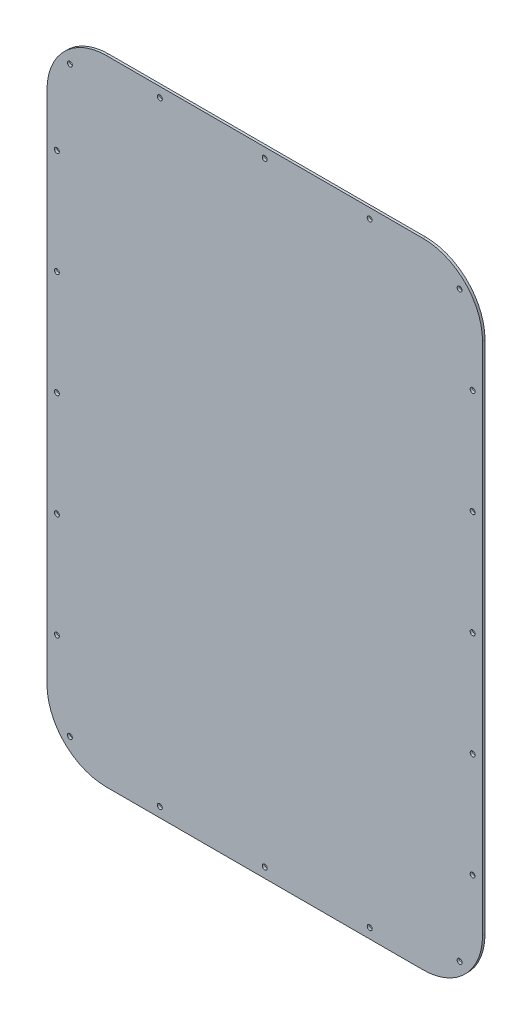
ISO-10303-21;
HEADER;
FILE_DESCRIPTION(('STEP AP214'),'2;1');
FILE_NAME('part.step','',(''),(''),'','','');
FILE_SCHEMA(('AUTOMOTIVE_DESIGN { 1 0 10303 214 1 1 1 1 }'));
ENDSEC;
DATA;
#1=APPLICATION_CONTEXT('core data for automotive mechanical design processes');
#2=APPLICATION_PROTOCOL_DEFINITION('international standard','automotive_design',2000,#1);
#3=PRODUCT_CONTEXT('',#1,'mechanical');
#4=PRODUCT('Part','Part','',(#3));
#5=PRODUCT_RELATED_PRODUCT_CATEGORY('part','',(#4));
#6=PRODUCT_DEFINITION_FORMATION('','',#4);
#7=PRODUCT_DEFINITION_CONTEXT('part definition',#1,'design');
#8=PRODUCT_DEFINITION('design','',#6,#7);
#9=PRODUCT_DEFINITION_SHAPE('','',#8);
#10=(LENGTH_UNIT() NAMED_UNIT(*) SI_UNIT(.MILLI.,.METRE.));
#11=(NAMED_UNIT(*) PLANE_ANGLE_UNIT() SI_UNIT($,.RADIAN.));
#12=(NAMED_UNIT(*) SI_UNIT($,.STERADIAN.) SOLID_ANGLE_UNIT());
#13=UNCERTAINTY_MEASURE_WITH_UNIT(LENGTH_MEASURE(1.E-05),#10,'distance_accuracy_value','');
#14=(GEOMETRIC_REPRESENTATION_CONTEXT(3) GLOBAL_UNCERTAINTY_ASSIGNED_CONTEXT((#13)) GLOBAL_UNIT_ASSIGNED_CONTEXT((#10,
#11,#12)) REPRESENTATION_CONTEXT('',''));
#15=CARTESIAN_POINT('',(0.,0.,0.));
#16=DIRECTION('',(0.,0.,1.));
#17=DIRECTION('',(1.,0.,0.));
#18=AXIS2_PLACEMENT_3D('',#15,#16,#17);
#19=CARTESIAN_POINT('',(152.4,1549.53972999994,3.175));
#20=DIRECTION('',(0.,0.,1.));
#21=DIRECTION('',(1.,0.,0.));
#22=AXIS2_PLACEMENT_3D('',#19,#20,#21);
#23=PLANE('',#22);
#24=CARTESIAN_POINT('',(220.98,1613.03972999994,3.175));
#25=DIRECTION('',(0.,0.,1.));
#26=DIRECTION('',(1.,0.,0.));
#27=AXIS2_PLACEMENT_3D('',#24,#25,#26);
#28=CIRCLE('',#27,3.17500000000012);
#29=CARTESIAN_POINT('',(224.155,1613.03972999994,3.175));
#30=VERTEX_POINT('',#29);
#31=EDGE_CURVE('E284',#30,#30,#28,.T.);
#32=ORIENTED_EDGE('',*,*,#31,.F.);
#33=EDGE_LOOP('',(#32));
#34=FACE_BOUND('',#33,.T.);
#35=CARTESIAN_POINT('',(355.6,825.63972999994,3.175));
#36=DIRECTION('',(0.,0.,1.));
#37=DIRECTION('',(1.,0.,0.));
#38=AXIS2_PLACEMENT_3D('',#35,#36,#37);
#39=CIRCLE('',#38,3.17499999999982);
#40=CARTESIAN_POINT('',(358.775,825.63972999994,3.175));
#41=VERTEX_POINT('',#40);
#42=EDGE_CURVE('E272',#41,#41,#39,.T.);
#43=ORIENTED_EDGE('',*,*,#42,.F.);
#44=EDGE_LOOP('',(#43));
#45=FACE_BOUND('',#44,.T.);
#46=CARTESIAN_POINT('',(220.98,825.63972999994,3.175));
#47=DIRECTION('',(0.,0.,1.));
#48=DIRECTION('',(1.,0.,0.));
#49=AXIS2_PLACEMENT_3D('',#46,#47,#48);
#50=CIRCLE('',#49,3.17499999999976);
#51=CARTESIAN_POINT('',(224.155,825.63972999994,3.175));
#52=VERTEX_POINT('',#51);
#53=EDGE_CURVE('E260',#52,#52,#50,.T.);
#54=ORIENTED_EDGE('',*,*,#53,.F.);
#55=EDGE_LOOP('',(#54));
#56=FACE_BOUND('',#55,.T.);
#57=CARTESIAN_POINT('',(622.3,1353.95972999994,3.175));
#58=DIRECTION('',(0.,0.,1.));
#59=DIRECTION('',(1.,0.,0.));
#60=AXIS2_PLACEMENT_3D('',#57,#58,#59);
#61=CIRCLE('',#60,3.17499999999971);
#62=CARTESIAN_POINT('',(625.475,1353.95972999994,3.175));
#63=VERTEX_POINT('',#62);
#64=EDGE_CURVE('E248',#63,#63,#61,.T.);
#65=ORIENTED_EDGE('',*,*,#64,.F.);
#66=EDGE_LOOP('',(#65));
#67=FACE_BOUND('',#66,.T.);
#68=CARTESIAN_POINT('',(622.3,1084.71972999994,3.175));
#69=DIRECTION('',(0.,0.,1.));
#70=DIRECTION('',(1.,0.,0.));
#71=AXIS2_PLACEMENT_3D('',#68,#69,#70);
#72=CIRCLE('',#71,3.17499999999971);
#73=CARTESIAN_POINT('',(625.475,1084.71972999994,3.175));
#74=VERTEX_POINT('',#73);
#75=EDGE_CURVE('E236',#74,#74,#72,.T.);
#76=ORIENTED_EDGE('',*,*,#75,.F.);
#77=EDGE_LOOP('',(#76));
#78=FACE_BOUND('',#77,.T.);
#79=CARTESIAN_POINT('',(622.3,1219.33972999994,3.175));
#80=DIRECTION('',(0.,0.,1.));
#81=DIRECTION('',(1.,0.,0.));
#82=AXIS2_PLACEMENT_3D('',#79,#80,#81);
#83=CIRCLE('',#82,3.17499999999971);
#84=CARTESIAN_POINT('',(625.475,1219.33972999994,3.175));
#85=VERTEX_POINT('',#84);
#86=EDGE_CURVE('E224',#85,#85,#83,.T.);
#87=ORIENTED_EDGE('',*,*,#86,.F.);
#88=EDGE_LOOP('',(#87));
#89=FACE_BOUND('',#88,.T.);
#90=CARTESIAN_POINT('',(88.9,1353.95972999994,3.175));
#91=DIRECTION('',(0.,0.,1.));
#92=DIRECTION('',(1.,0.,0.));
#93=AXIS2_PLACEMENT_3D('',#90,#91,#92);
#94=CIRCLE('',#93,3.17500000000003);
#95=CARTESIAN_POINT('',(92.075,1353.95972999994,3.175));
#96=VERTEX_POINT('',#95);
#97=EDGE_CURVE('E212',#96,#96,#94,.T.);
#98=ORIENTED_EDGE('',*,*,#97,.F.);
#99=EDGE_LOOP('',(#98));
#100=FACE_BOUND('',#99,.T.);
#101=CARTESIAN_POINT('',(88.9,1084.71972999994,3.175));
#102=DIRECTION('',(0.,0.,1.));
#103=DIRECTION('',(1.,0.,0.));
#104=AXIS2_PLACEMENT_3D('',#101,#102,#103);
#105=CIRCLE('',#104,3.1749999999998);
#106=CARTESIAN_POINT('',(92.0749999999998,1084.71972999994,3.175));
#107=VERTEX_POINT('',#106);
#108=EDGE_CURVE('E200',#107,#107,#105,.T.);
#109=ORIENTED_EDGE('',*,*,#108,.F.);
#110=EDGE_LOOP('',(#109));
#111=FACE_BOUND('',#110,.T.);
#112=CARTESIAN_POINT('',(105.58268435364,845.81218685586,3.175));
#113=DIRECTION('',(0.,0.,1.));
#114=DIRECTION('',(1.,0.,0.));
#115=AXIS2_PLACEMENT_3D('',#112,#113,#114);
#116=CIRCLE('',#115,3.17499999999978);
#117=CARTESIAN_POINT('',(108.75768435364,845.81218685586,3.175));
#118=VERTEX_POINT('',#117);
#119=EDGE_CURVE('E188',#118,#118,#116,.T.);
#120=ORIENTED_EDGE('',*,*,#119,.F.);
#121=EDGE_LOOP('',(#120));
#122=FACE_BOUND('',#121,.T.);
#123=CARTESIAN_POINT('',(605.61731564636,1592.86727314402,3.175));
#124=DIRECTION('',(0.,0.,1.));
#125=DIRECTION('',(1.,0.,0.));
#126=AXIS2_PLACEMENT_3D('',#123,#124,#125);
#127=CIRCLE('',#126,3.17500000000026);
#128=CARTESIAN_POINT('',(608.79231564636,1592.86727314402,3.175));
#129=VERTEX_POINT('',#128);
#130=EDGE_CURVE('E134',#129,#129,#127,.T.);
#131=ORIENTED_EDGE('',*,*,#130,.F.);
#132=EDGE_LOOP('',(#131));
#133=FACE_BOUND('',#132,.T.);
#134=CARTESIAN_POINT('',(152.4,1549.53972999994,3.175));
#135=DIRECTION('',(0.,0.,1.));
#136=DIRECTION('',(1.,0.,0.));
#137=AXIS2_PLACEMENT_3D('',#134,#135,#136);
#138=CIRCLE('',#137,76.2000000000004);
#139=CARTESIAN_POINT('',(152.4,1625.73972999994,3.175));
#140=VERTEX_POINT('',#139);
#141=CARTESIAN_POINT('',(76.2,1549.53972999994,3.175));
#142=VERTEX_POINT('',#141);
#143=EDGE_CURVE('E145',#140,#142,#138,.T.);
#144=ORIENTED_EDGE('',*,*,#143,.T.);
#145=DIRECTION('',(0.,-1.,0.));
#146=VECTOR('',#145,1.);
#147=CARTESIAN_POINT('',(76.2,1549.53972999994,3.175));
#148=LINE('',#147,#146);
#149=CARTESIAN_POINT('',(76.2,889.13972999994,3.175));
#150=VERTEX_POINT('',#149);
#151=EDGE_CURVE('E93',#142,#150,#148,.T.);
#152=ORIENTED_EDGE('',*,*,#151,.T.);
#153=CARTESIAN_POINT('',(152.4,889.13972999994,3.175));
#154=DIRECTION('',(0.,0.,1.));
#155=DIRECTION('',(1.,0.,0.));
#156=AXIS2_PLACEMENT_3D('',#153,#154,#155);
#157=CIRCLE('',#156,76.2000000000002);
#158=CARTESIAN_POINT('',(152.4,812.93972999994,3.175));
#159=VERTEX_POINT('',#158);
#160=EDGE_CURVE('E160',#150,#159,#157,.T.);
#161=ORIENTED_EDGE('',*,*,#160,.T.);
#162=DIRECTION('',(1.,0.,0.));
#163=VECTOR('',#162,1.);
#164=CARTESIAN_POINT('',(152.4,812.93972999994,3.175));
#165=LINE('',#164,#163);
#166=CARTESIAN_POINT('',(558.8,812.93972999994,3.175));
#167=VERTEX_POINT('',#166);
#168=EDGE_CURVE('E173',#159,#167,#165,.T.);
#169=ORIENTED_EDGE('',*,*,#168,.T.);
#170=CARTESIAN_POINT('',(558.8,889.13972999994,3.175));
#171=DIRECTION('',(0.,0.,1.));
#172=DIRECTION('',(1.,0.,0.));
#173=AXIS2_PLACEMENT_3D('',#170,#171,#172);
#174=CIRCLE('',#173,76.2000000000002);
#175=CARTESIAN_POINT('',(635.,889.13972999994,3.175));
#176=VERTEX_POINT('',#175);
#177=EDGE_CURVE('E112',#167,#176,#174,.T.);
#178=ORIENTED_EDGE('',*,*,#177,.T.);
#179=DIRECTION('',(0.,1.,0.));
#180=VECTOR('',#179,1.);
#181=CARTESIAN_POINT('',(635.,889.13972999994,3.175));
#182=LINE('',#181,#180);
#183=CARTESIAN_POINT('',(635.,1549.53972999994,3.175));
#184=VERTEX_POINT('',#183);
#185=EDGE_CURVE('E106',#176,#184,#182,.T.);
#186=ORIENTED_EDGE('',*,*,#185,.T.);
#187=CARTESIAN_POINT('',(558.8,1549.53972999994,3.175));
#188=DIRECTION('',(0.,0.,1.));
#189=DIRECTION('',(1.,0.,0.));
#190=AXIS2_PLACEMENT_3D('',#187,#188,#189);
#191=CIRCLE('',#190,76.1999999999996);
#192=CARTESIAN_POINT('',(558.8,1625.73972999994,3.175));
#193=VERTEX_POINT('',#192);
#194=EDGE_CURVE('E110',#184,#193,#191,.T.);
#195=ORIENTED_EDGE('',*,*,#194,.T.);
#196=DIRECTION('',(-1.,0.,0.));
#197=VECTOR('',#196,1.);
#198=CARTESIAN_POINT('',(558.8,1625.73972999994,3.175));
#199=LINE('',#198,#197);
#200=EDGE_CURVE('E50',#193,#140,#199,.T.);
#201=ORIENTED_EDGE('',*,*,#200,.T.);
#202=EDGE_LOOP('',(#144,#152,#161,#169,#178,#186,#195,#201));
#203=FACE_BOUND('',#202,.T.);
#204=CARTESIAN_POINT('',(605.61731564636,845.81218685586,3.175));
#205=DIRECTION('',(0.,0.,1.));
#206=DIRECTION('',(1.,0.,0.));
#207=AXIS2_PLACEMENT_3D('',#204,#205,#206);
#208=CIRCLE('',#207,3.17500000000004);
#209=CARTESIAN_POINT('',(608.79231564636,845.81218685586,3.175));
#210=VERTEX_POINT('',#209);
#211=EDGE_CURVE('E182',#210,#210,#208,.T.);
#212=ORIENTED_EDGE('',*,*,#211,.F.);
#213=EDGE_LOOP('',(#212));
#214=FACE_BOUND('',#213,.T.);
#215=CARTESIAN_POINT('',(88.9,1219.33972999994,3.175));
#216=DIRECTION('',(0.,0.,1.));
#217=DIRECTION('',(1.,0.,0.));
#218=AXIS2_PLACEMENT_3D('',#215,#216,#217);
#219=CIRCLE('',#218,3.1749999999998);
#220=CARTESIAN_POINT('',(92.0749999999998,1219.33972999994,3.175));
#221=VERTEX_POINT('',#220);
#222=EDGE_CURVE('E194',#221,#221,#219,.T.);
#223=ORIENTED_EDGE('',*,*,#222,.F.);
#224=EDGE_LOOP('',(#223));
#225=FACE_BOUND('',#224,.T.);
#226=CARTESIAN_POINT('',(88.9,1488.57972999994,3.175));
#227=DIRECTION('',(0.,0.,1.));
#228=DIRECTION('',(1.,0.,0.));
#229=AXIS2_PLACEMENT_3D('',#226,#227,#228);
#230=CIRCLE('',#229,3.17500000000019);
#231=CARTESIAN_POINT('',(92.0750000000002,1488.57972999994,3.175));
#232=VERTEX_POINT('',#231);
#233=EDGE_CURVE('E206',#232,#232,#230,.T.);
#234=ORIENTED_EDGE('',*,*,#233,.F.);
#235=EDGE_LOOP('',(#234));
#236=FACE_BOUND('',#235,.T.);
#237=CARTESIAN_POINT('',(88.9,950.09972999994,3.175));
#238=DIRECTION('',(0.,0.,1.));
#239=DIRECTION('',(1.,0.,0.));
#240=AXIS2_PLACEMENT_3D('',#237,#238,#239);
#241=CIRCLE('',#240,3.17499999999989);
#242=CARTESIAN_POINT('',(92.0749999999999,950.09972999994,3.175));
#243=VERTEX_POINT('',#242);
#244=EDGE_CURVE('E218',#243,#243,#241,.T.);
#245=ORIENTED_EDGE('',*,*,#244,.F.);
#246=EDGE_LOOP('',(#245));
#247=FACE_BOUND('',#246,.T.);
#248=CARTESIAN_POINT('',(622.3,950.09972999994,3.175));
#249=DIRECTION('',(0.,0.,1.));
#250=DIRECTION('',(1.,0.,0.));
#251=AXIS2_PLACEMENT_3D('',#248,#249,#250);
#252=CIRCLE('',#251,3.17499999999971);
#253=CARTESIAN_POINT('',(625.475,950.09972999994,3.175));
#254=VERTEX_POINT('',#253);
#255=EDGE_CURVE('E230',#254,#254,#252,.T.);
#256=ORIENTED_EDGE('',*,*,#255,.F.);
#257=EDGE_LOOP('',(#256));
#258=FACE_BOUND('',#257,.T.);
#259=CARTESIAN_POINT('',(622.3,1488.57972999994,3.175));
#260=DIRECTION('',(0.,0.,1.));
#261=DIRECTION('',(1.,0.,0.));
#262=AXIS2_PLACEMENT_3D('',#259,#260,#261);
#263=CIRCLE('',#262,3.17499999999993);
#264=CARTESIAN_POINT('',(625.475,1488.57972999994,3.175));
#265=VERTEX_POINT('',#264);
#266=EDGE_CURVE('E242',#265,#265,#263,.T.);
#267=ORIENTED_EDGE('',*,*,#266,.F.);
#268=EDGE_LOOP('',(#267));
#269=FACE_BOUND('',#268,.T.);
#270=CARTESIAN_POINT('',(355.6,1613.03972999994,3.175));
#271=DIRECTION('',(0.,0.,1.));
#272=DIRECTION('',(1.,0.,0.));
#273=AXIS2_PLACEMENT_3D('',#270,#271,#272);
#274=CIRCLE('',#273,3.17500000000015);
#275=CARTESIAN_POINT('',(358.775,1613.03972999994,3.175));
#276=VERTEX_POINT('',#275);
#277=EDGE_CURVE('E254',#276,#276,#274,.T.);
#278=ORIENTED_EDGE('',*,*,#277,.F.);
#279=EDGE_LOOP('',(#278));
#280=FACE_BOUND('',#279,.T.);
#281=CARTESIAN_POINT('',(490.22,825.63972999994,3.175));
#282=DIRECTION('',(0.,0.,1.));
#283=DIRECTION('',(1.,0.,0.));
#284=AXIS2_PLACEMENT_3D('',#281,#282,#283);
#285=CIRCLE('',#284,3.17499999999982);
#286=CARTESIAN_POINT('',(493.395,825.63972999994,3.175));
#287=VERTEX_POINT('',#286);
#288=EDGE_CURVE('E266',#287,#287,#285,.T.);
#289=ORIENTED_EDGE('',*,*,#288,.F.);
#290=EDGE_LOOP('',(#289));
#291=FACE_BOUND('',#290,.T.);
#292=CARTESIAN_POINT('',(105.58268435364,1592.86727314402,3.175));
#293=DIRECTION('',(0.,0.,1.));
#294=DIRECTION('',(1.,0.,0.));
#295=AXIS2_PLACEMENT_3D('',#292,#293,#294);
#296=CIRCLE('',#295,3.17499999999982);
#297=CARTESIAN_POINT('',(108.75768435364,1592.86727314402,3.175));
#298=VERTEX_POINT('',#297);
#299=EDGE_CURVE('E278',#298,#298,#296,.T.);
#300=ORIENTED_EDGE('',*,*,#299,.F.);
#301=EDGE_LOOP('',(#300));
#302=FACE_BOUND('',#301,.T.);
#303=CARTESIAN_POINT('',(490.22,1613.03972999994,3.175));
#304=DIRECTION('',(0.,0.,1.));
#305=DIRECTION('',(1.,0.,0.));
#306=AXIS2_PLACEMENT_3D('',#303,#304,#305);
#307=CIRCLE('',#306,3.17499999999971);
#308=CARTESIAN_POINT('',(493.395,1613.03972999994,3.175));
#309=VERTEX_POINT('',#308);
#310=EDGE_CURVE('E290',#309,#309,#307,.T.);
#311=ORIENTED_EDGE('',*,*,#310,.F.);
#312=EDGE_LOOP('',(#311));
#313=FACE_BOUND('',#312,.T.);
#314=ADVANCED_FACE('F33',(#34,#45,#56,#67,#78,#89,#100,#111,#122,#133,#203,#214,#225,#236,#247,
#258,#269,#280,#291,#302,#313),#23,.T.);
#315=CARTESIAN_POINT('',(152.4,1549.53972999994,0.));
#316=DIRECTION('',(0.,0.,1.));
#317=DIRECTION('',(1.,0.,0.));
#318=AXIS2_PLACEMENT_3D('',#315,#316,#317);
#319=PLANE('',#318);
#320=CARTESIAN_POINT('',(152.4,1549.53972999994,0.));
#321=DIRECTION('',(0.,0.,1.));
#322=DIRECTION('',(1.,0.,0.));
#323=AXIS2_PLACEMENT_3D('',#320,#321,#322);
#324=CIRCLE('',#323,76.2000000000004);
#325=CARTESIAN_POINT('',(152.4,1625.73972999994,0.));
#326=VERTEX_POINT('',#325);
#327=CARTESIAN_POINT('',(76.2,1549.53972999994,0.));
#328=VERTEX_POINT('',#327);
#329=EDGE_CURVE('E130',#326,#328,#324,.T.);
#330=ORIENTED_EDGE('',*,*,#329,.F.);
#331=DIRECTION('',(-1.,0.,0.));
#332=VECTOR('',#331,1.);
#333=CARTESIAN_POINT('',(558.8,1625.73972999994,0.));
#334=LINE('',#333,#332);
#335=CARTESIAN_POINT('',(558.8,1625.73972999994,0.));
#336=VERTEX_POINT('',#335);
#337=EDGE_CURVE('E85',#336,#326,#334,.T.);
#338=ORIENTED_EDGE('',*,*,#337,.F.);
#339=CARTESIAN_POINT('',(558.8,1549.53972999994,0.));
#340=DIRECTION('',(0.,0.,1.));
#341=DIRECTION('',(1.,0.,0.));
#342=AXIS2_PLACEMENT_3D('',#339,#340,#341);
#343=CIRCLE('',#342,76.1999999999996);
#344=CARTESIAN_POINT('',(635.,1549.53972999994,0.));
#345=VERTEX_POINT('',#344);
#346=EDGE_CURVE('E79',#345,#336,#343,.T.);
#347=ORIENTED_EDGE('',*,*,#346,.F.);
#348=DIRECTION('',(0.,1.,0.));
#349=VECTOR('',#348,1.);
#350=CARTESIAN_POINT('',(635.,889.13972999994,0.));
#351=LINE('',#350,#349);
#352=CARTESIAN_POINT('',(635.,889.13972999994,0.));
#353=VERTEX_POINT('',#352);
#354=EDGE_CURVE('E120',#353,#345,#351,.T.);
#355=ORIENTED_EDGE('',*,*,#354,.F.);
#356=CARTESIAN_POINT('',(558.8,889.13972999994,0.));
#357=DIRECTION('',(0.,0.,1.));
#358=DIRECTION('',(1.,0.,0.));
#359=AXIS2_PLACEMENT_3D('',#356,#357,#358);
#360=CIRCLE('',#359,76.2000000000002);
#361=CARTESIAN_POINT('',(558.8,812.93972999994,0.));
#362=VERTEX_POINT('',#361);
#363=EDGE_CURVE('E140',#362,#353,#360,.T.);
#364=ORIENTED_EDGE('',*,*,#363,.F.);
#365=DIRECTION('',(1.,0.,0.));
#366=VECTOR('',#365,1.);
#367=CARTESIAN_POINT('',(152.4,812.93972999994,0.));
#368=LINE('',#367,#366);
#369=CARTESIAN_POINT('',(152.4,812.93972999994,0.));
#370=VERTEX_POINT('',#369);
#371=EDGE_CURVE('E138',#370,#362,#368,.T.);
#372=ORIENTED_EDGE('',*,*,#371,.F.);
#373=CARTESIAN_POINT('',(152.4,889.13972999994,0.));
#374=DIRECTION('',(0.,0.,1.));
#375=DIRECTION('',(1.,0.,0.));
#376=AXIS2_PLACEMENT_3D('',#373,#374,#375);
#377=CIRCLE('',#376,76.2000000000002);
#378=CARTESIAN_POINT('',(76.2,889.13972999994,0.));
#379=VERTEX_POINT('',#378);
#380=EDGE_CURVE('E136',#379,#370,#377,.T.);
#381=ORIENTED_EDGE('',*,*,#380,.F.);
#382=DIRECTION('',(0.,-1.,0.));
#383=VECTOR('',#382,1.);
#384=CARTESIAN_POINT('',(76.2,1549.53972999994,0.));
#385=LINE('',#384,#383);
#386=EDGE_CURVE('E133',#328,#379,#385,.T.);
#387=ORIENTED_EDGE('',*,*,#386,.F.);
#388=EDGE_LOOP('',(#330,#338,#347,#355,#364,#372,#381,#387));
#389=FACE_BOUND('',#388,.T.);
#390=CARTESIAN_POINT('',(605.61731564636,1592.86727314402,0.));
#391=DIRECTION('',(0.,0.,1.));
#392=DIRECTION('',(1.,0.,0.));
#393=AXIS2_PLACEMENT_3D('',#390,#391,#392);
#394=CIRCLE('',#393,3.17500000000026);
#395=CARTESIAN_POINT('',(608.79231564636,1592.86727314402,0.));
#396=VERTEX_POINT('',#395);
#397=EDGE_CURVE('E179',#396,#396,#394,.T.);
#398=ORIENTED_EDGE('',*,*,#397,.T.);
#399=EDGE_LOOP('',(#398));
#400=FACE_BOUND('',#399,.T.);
#401=CARTESIAN_POINT('',(605.61731564636,845.81218685586,0.));
#402=DIRECTION('',(0.,0.,1.));
#403=DIRECTION('',(1.,0.,0.));
#404=AXIS2_PLACEMENT_3D('',#401,#402,#403);
#405=CIRCLE('',#404,3.17500000000004);
#406=CARTESIAN_POINT('',(608.79231564636,845.81218685586,0.));
#407=VERTEX_POINT('',#406);
#408=EDGE_CURVE('E185',#407,#407,#405,.T.);
#409=ORIENTED_EDGE('',*,*,#408,.T.);
#410=EDGE_LOOP('',(#409));
#411=FACE_BOUND('',#410,.T.);
#412=CARTESIAN_POINT('',(105.58268435364,845.81218685586,0.));
#413=DIRECTION('',(0.,0.,1.));
#414=DIRECTION('',(1.,0.,0.));
#415=AXIS2_PLACEMENT_3D('',#412,#413,#414);
#416=CIRCLE('',#415,3.17499999999978);
#417=CARTESIAN_POINT('',(108.75768435364,845.81218685586,0.));
#418=VERTEX_POINT('',#417);
#419=EDGE_CURVE('E191',#418,#418,#416,.T.);
#420=ORIENTED_EDGE('',*,*,#419,.T.);
#421=EDGE_LOOP('',(#420));
#422=FACE_BOUND('',#421,.T.);
#423=CARTESIAN_POINT('',(88.9,1219.33972999994,0.));
#424=DIRECTION('',(0.,0.,1.));
#425=DIRECTION('',(1.,0.,0.));
#426=AXIS2_PLACEMENT_3D('',#423,#424,#425);
#427=CIRCLE('',#426,3.1749999999998);
#428=CARTESIAN_POINT('',(92.0749999999998,1219.33972999994,0.));
#429=VERTEX_POINT('',#428);
#430=EDGE_CURVE('E197',#429,#429,#427,.T.);
#431=ORIENTED_EDGE('',*,*,#430,.T.);
#432=EDGE_LOOP('',(#431));
#433=FACE_BOUND('',#432,.T.);
#434=CARTESIAN_POINT('',(88.9,1084.71972999994,0.));
#435=DIRECTION('',(0.,0.,1.));
#436=DIRECTION('',(1.,0.,0.));
#437=AXIS2_PLACEMENT_3D('',#434,#435,#436);
#438=CIRCLE('',#437,3.1749999999998);
#439=CARTESIAN_POINT('',(92.0749999999998,1084.71972999994,0.));
#440=VERTEX_POINT('',#439);
#441=EDGE_CURVE('E203',#440,#440,#438,.T.);
#442=ORIENTED_EDGE('',*,*,#441,.T.);
#443=EDGE_LOOP('',(#442));
#444=FACE_BOUND('',#443,.T.);
#445=CARTESIAN_POINT('',(88.9,1488.57972999994,0.));
#446=DIRECTION('',(0.,0.,1.));
#447=DIRECTION('',(1.,0.,0.));
#448=AXIS2_PLACEMENT_3D('',#445,#446,#447);
#449=CIRCLE('',#448,3.17500000000019);
#450=CARTESIAN_POINT('',(92.0750000000002,1488.57972999994,0.));
#451=VERTEX_POINT('',#450);
#452=EDGE_CURVE('E209',#451,#451,#449,.T.);
#453=ORIENTED_EDGE('',*,*,#452,.T.);
#454=EDGE_LOOP('',(#453));
#455=FACE_BOUND('',#454,.T.);
#456=CARTESIAN_POINT('',(88.9,1353.95972999994,0.));
#457=DIRECTION('',(0.,0.,1.));
#458=DIRECTION('',(1.,0.,0.));
#459=AXIS2_PLACEMENT_3D('',#456,#457,#458);
#460=CIRCLE('',#459,3.17500000000003);
#461=CARTESIAN_POINT('',(92.075,1353.95972999994,0.));
#462=VERTEX_POINT('',#461);
#463=EDGE_CURVE('E215',#462,#462,#460,.T.);
#464=ORIENTED_EDGE('',*,*,#463,.T.);
#465=EDGE_LOOP('',(#464));
#466=FACE_BOUND('',#465,.T.);
#467=CARTESIAN_POINT('',(88.9,950.09972999994,0.));
#468=DIRECTION('',(0.,0.,1.));
#469=DIRECTION('',(1.,0.,0.));
#470=AXIS2_PLACEMENT_3D('',#467,#468,#469);
#471=CIRCLE('',#470,3.17499999999989);
#472=CARTESIAN_POINT('',(92.0749999999999,950.09972999994,0.));
#473=VERTEX_POINT('',#472);
#474=EDGE_CURVE('E221',#473,#473,#471,.T.);
#475=ORIENTED_EDGE('',*,*,#474,.T.);
#476=EDGE_LOOP('',(#475));
#477=FACE_BOUND('',#476,.T.);
#478=CARTESIAN_POINT('',(622.3,1219.33972999994,0.));
#479=DIRECTION('',(0.,0.,1.));
#480=DIRECTION('',(1.,0.,0.));
#481=AXIS2_PLACEMENT_3D('',#478,#479,#480);
#482=CIRCLE('',#481,3.17499999999971);
#483=CARTESIAN_POINT('',(625.475,1219.33972999994,0.));
#484=VERTEX_POINT('',#483);
#485=EDGE_CURVE('E227',#484,#484,#482,.T.);
#486=ORIENTED_EDGE('',*,*,#485,.T.);
#487=EDGE_LOOP('',(#486));
#488=FACE_BOUND('',#487,.T.);
#489=CARTESIAN_POINT('',(622.3,950.09972999994,0.));
#490=DIRECTION('',(0.,0.,1.));
#491=DIRECTION('',(1.,0.,0.));
#492=AXIS2_PLACEMENT_3D('',#489,#490,#491);
#493=CIRCLE('',#492,3.17499999999971);
#494=CARTESIAN_POINT('',(625.475,950.09972999994,0.));
#495=VERTEX_POINT('',#494);
#496=EDGE_CURVE('E233',#495,#495,#493,.T.);
#497=ORIENTED_EDGE('',*,*,#496,.T.);
#498=EDGE_LOOP('',(#497));
#499=FACE_BOUND('',#498,.T.);
#500=CARTESIAN_POINT('',(622.3,1084.71972999994,0.));
#501=DIRECTION('',(0.,0.,1.));
#502=DIRECTION('',(1.,0.,0.));
#503=AXIS2_PLACEMENT_3D('',#500,#501,#502);
#504=CIRCLE('',#503,3.17499999999971);
#505=CARTESIAN_POINT('',(625.475,1084.71972999994,0.));
#506=VERTEX_POINT('',#505);
#507=EDGE_CURVE('E239',#506,#506,#504,.T.);
#508=ORIENTED_EDGE('',*,*,#507,.T.);
#509=EDGE_LOOP('',(#508));
#510=FACE_BOUND('',#509,.T.);
#511=CARTESIAN_POINT('',(622.3,1488.57972999994,0.));
#512=DIRECTION('',(0.,0.,1.));
#513=DIRECTION('',(1.,0.,0.));
#514=AXIS2_PLACEMENT_3D('',#511,#512,#513);
#515=CIRCLE('',#514,3.17499999999993);
#516=CARTESIAN_POINT('',(625.475,1488.57972999994,0.));
#517=VERTEX_POINT('',#516);
#518=EDGE_CURVE('E245',#517,#517,#515,.T.);
#519=ORIENTED_EDGE('',*,*,#518,.T.);
#520=EDGE_LOOP('',(#519));
#521=FACE_BOUND('',#520,.T.);
#522=CARTESIAN_POINT('',(622.3,1353.95972999994,0.));
#523=DIRECTION('',(0.,0.,1.));
#524=DIRECTION('',(1.,0.,0.));
#525=AXIS2_PLACEMENT_3D('',#522,#523,#524);
#526=CIRCLE('',#525,3.17499999999971);
#527=CARTESIAN_POINT('',(625.475,1353.95972999994,0.));
#528=VERTEX_POINT('',#527);
#529=EDGE_CURVE('E251',#528,#528,#526,.T.);
#530=ORIENTED_EDGE('',*,*,#529,.T.);
#531=EDGE_LOOP('',(#530));
#532=FACE_BOUND('',#531,.T.);
#533=CARTESIAN_POINT('',(355.6,1613.03972999994,0.));
#534=DIRECTION('',(0.,0.,1.));
#535=DIRECTION('',(1.,0.,0.));
#536=AXIS2_PLACEMENT_3D('',#533,#534,#535);
#537=CIRCLE('',#536,3.17500000000015);
#538=CARTESIAN_POINT('',(358.775,1613.03972999994,0.));
#539=VERTEX_POINT('',#538);
#540=EDGE_CURVE('E257',#539,#539,#537,.T.);
#541=ORIENTED_EDGE('',*,*,#540,.T.);
#542=EDGE_LOOP('',(#541));
#543=FACE_BOUND('',#542,.T.);
#544=CARTESIAN_POINT('',(220.98,825.63972999994,0.));
#545=DIRECTION('',(0.,0.,1.));
#546=DIRECTION('',(1.,0.,0.));
#547=AXIS2_PLACEMENT_3D('',#544,#545,#546);
#548=CIRCLE('',#547,3.17499999999976);
#549=CARTESIAN_POINT('',(224.155,825.63972999994,0.));
#550=VERTEX_POINT('',#549);
#551=EDGE_CURVE('E263',#550,#550,#548,.T.);
#552=ORIENTED_EDGE('',*,*,#551,.T.);
#553=EDGE_LOOP('',(#552));
#554=FACE_BOUND('',#553,.T.);
#555=CARTESIAN_POINT('',(490.22,825.63972999994,0.));
#556=DIRECTION('',(0.,0.,1.));
#557=DIRECTION('',(1.,0.,0.));
#558=AXIS2_PLACEMENT_3D('',#555,#556,#557);
#559=CIRCLE('',#558,3.17499999999982);
#560=CARTESIAN_POINT('',(493.395,825.63972999994,0.));
#561=VERTEX_POINT('',#560);
#562=EDGE_CURVE('E269',#561,#561,#559,.T.);
#563=ORIENTED_EDGE('',*,*,#562,.T.);
#564=EDGE_LOOP('',(#563));
#565=FACE_BOUND('',#564,.T.);
#566=CARTESIAN_POINT('',(355.6,825.63972999994,0.));
#567=DIRECTION('',(0.,0.,1.));
#568=DIRECTION('',(1.,0.,0.));
#569=AXIS2_PLACEMENT_3D('',#566,#567,#568);
#570=CIRCLE('',#569,3.17499999999982);
#571=CARTESIAN_POINT('',(358.775,825.63972999994,0.));
#572=VERTEX_POINT('',#571);
#573=EDGE_CURVE('E275',#572,#572,#570,.T.);
#574=ORIENTED_EDGE('',*,*,#573,.T.);
#575=EDGE_LOOP('',(#574));
#576=FACE_BOUND('',#575,.T.);
#577=CARTESIAN_POINT('',(105.58268435364,1592.86727314402,0.));
#578=DIRECTION('',(0.,0.,1.));
#579=DIRECTION('',(1.,0.,0.));
#580=AXIS2_PLACEMENT_3D('',#577,#578,#579);
#581=CIRCLE('',#580,3.17499999999982);
#582=CARTESIAN_POINT('',(108.75768435364,1592.86727314402,0.));
#583=VERTEX_POINT('',#582);
#584=EDGE_CURVE('E281',#583,#583,#581,.T.);
#585=ORIENTED_EDGE('',*,*,#584,.T.);
#586=EDGE_LOOP('',(#585));
#587=FACE_BOUND('',#586,.T.);
#588=CARTESIAN_POINT('',(220.98,1613.03972999994,0.));
#589=DIRECTION('',(0.,0.,1.));
#590=DIRECTION('',(1.,0.,0.));
#591=AXIS2_PLACEMENT_3D('',#588,#589,#590);
#592=CIRCLE('',#591,3.17500000000012);
#593=CARTESIAN_POINT('',(224.155,1613.03972999994,0.));
#594=VERTEX_POINT('',#593);
#595=EDGE_CURVE('E287',#594,#594,#592,.T.);
#596=ORIENTED_EDGE('',*,*,#595,.T.);
#597=EDGE_LOOP('',(#596));
#598=FACE_BOUND('',#597,.T.);
#599=CARTESIAN_POINT('',(490.22,1613.03972999994,0.));
#600=DIRECTION('',(0.,0.,1.));
#601=DIRECTION('',(1.,0.,0.));
#602=AXIS2_PLACEMENT_3D('',#599,#600,#601);
#603=CIRCLE('',#602,3.17499999999971);
#604=CARTESIAN_POINT('',(493.395,1613.03972999994,0.));
#605=VERTEX_POINT('',#604);
#606=EDGE_CURVE('E293',#605,#605,#603,.T.);
#607=ORIENTED_EDGE('',*,*,#606,.T.);
#608=EDGE_LOOP('',(#607));
#609=FACE_BOUND('',#608,.T.);
#610=ADVANCED_FACE('F164',(#389,#400,#411,#422,#433,#444,#455,#466,#477,#488,#499,#510,#521,
#532,#543,#554,#565,#576,#587,#598,#609),#319,.F.);
#611=CARTESIAN_POINT('',(152.4,1549.53972999994,3.175));
#612=DIRECTION('',(0.,0.,-1.));
#613=DIRECTION('',(-1.,0.,0.));
#614=AXIS2_PLACEMENT_3D('',#611,#612,#613);
#615=CYLINDRICAL_SURFACE('',#614,76.2000000000004);
#616=ORIENTED_EDGE('',*,*,#329,.T.);
#617=DIRECTION('',(0.,0.,-1.));
#618=VECTOR('',#617,1.);
#619=CARTESIAN_POINT('',(76.2,1549.53972999994,3.175));
#620=LINE('',#619,#618);
#621=EDGE_CURVE('E11',#142,#328,#620,.T.);
#622=ORIENTED_EDGE('',*,*,#621,.F.);
#623=ORIENTED_EDGE('',*,*,#143,.F.);
#624=DIRECTION('',(0.,0.,-1.));
#625=VECTOR('',#624,1.);
#626=CARTESIAN_POINT('',(152.4,1625.73972999994,3.175));
#627=LINE('',#626,#625);
#628=EDGE_CURVE('E126',#140,#326,#627,.T.);
#629=ORIENTED_EDGE('',*,*,#628,.T.);
#630=EDGE_LOOP('',(#616,#622,#623,#629));
#631=FACE_BOUND('',#630,.T.);
#632=ADVANCED_FACE('F35',(#631),#615,.T.);
#633=CARTESIAN_POINT('',(76.2,1549.53972999994,3.175));
#634=DIRECTION('',(1.,0.,0.));
#635=DIRECTION('',(0.,0.,-1.));
#636=AXIS2_PLACEMENT_3D('',#633,#634,#635);
#637=PLANE('',#636);
#638=ORIENTED_EDGE('',*,*,#386,.T.);
#639=DIRECTION('',(0.,0.,-1.));
#640=VECTOR('',#639,1.);
#641=CARTESIAN_POINT('',(76.2,889.13972999994,3.175));
#642=LINE('',#641,#640);
#643=EDGE_CURVE('E42',#150,#379,#642,.T.);
#644=ORIENTED_EDGE('',*,*,#643,.F.);
#645=ORIENTED_EDGE('',*,*,#151,.F.);
#646=ORIENTED_EDGE('',*,*,#621,.T.);
#647=EDGE_LOOP('',(#638,#644,#645,#646));
#648=FACE_BOUND('',#647,.T.);
#649=ADVANCED_FACE('F327',(#648),#637,.F.);
#650=CARTESIAN_POINT('',(152.4,889.13972999994,3.175));
#651=DIRECTION('',(0.,0.,-1.));
#652=DIRECTION('',(-1.,0.,0.));
#653=AXIS2_PLACEMENT_3D('',#650,#651,#652);
#654=CYLINDRICAL_SURFACE('',#653,76.2000000000002);
#655=ORIENTED_EDGE('',*,*,#380,.T.);
#656=DIRECTION('',(0.,0.,-1.));
#657=VECTOR('',#656,1.);
#658=CARTESIAN_POINT('',(152.4,812.93972999994,3.175));
#659=LINE('',#658,#657);
#660=EDGE_CURVE('E152',#159,#370,#659,.T.);
#661=ORIENTED_EDGE('',*,*,#660,.F.);
#662=ORIENTED_EDGE('',*,*,#160,.F.);
#663=ORIENTED_EDGE('',*,*,#643,.T.);
#664=EDGE_LOOP('',(#655,#661,#662,#663));
#665=FACE_BOUND('',#664,.T.);
#666=ADVANCED_FACE('F158',(#665),#654,.T.);
#667=CARTESIAN_POINT('',(152.4,812.93972999994,3.175));
#668=DIRECTION('',(0.,1.,0.));
#669=DIRECTION('',(0.,0.,1.));
#670=AXIS2_PLACEMENT_3D('',#667,#668,#669);
#671=PLANE('',#670);
#672=ORIENTED_EDGE('',*,*,#371,.T.);
#673=DIRECTION('',(0.,0.,-1.));
#674=VECTOR('',#673,1.);
#675=CARTESIAN_POINT('',(558.8,812.93972999994,3.175));
#676=LINE('',#675,#674);
#677=EDGE_CURVE('E149',#167,#362,#676,.T.);
#678=ORIENTED_EDGE('',*,*,#677,.F.);
#679=ORIENTED_EDGE('',*,*,#168,.F.);
#680=ORIENTED_EDGE('',*,*,#660,.T.);
#681=EDGE_LOOP('',(#672,#678,#679,#680));
#682=FACE_BOUND('',#681,.T.);
#683=ADVANCED_FACE('F169',(#682),#671,.F.);
#684=CARTESIAN_POINT('',(558.8,889.13972999994,3.175));
#685=DIRECTION('',(0.,0.,-1.));
#686=DIRECTION('',(-1.,0.,0.));
#687=AXIS2_PLACEMENT_3D('',#684,#685,#686);
#688=CYLINDRICAL_SURFACE('',#687,76.2000000000002);
#689=ORIENTED_EDGE('',*,*,#363,.T.);
#690=DIRECTION('',(0.,0.,-1.));
#691=VECTOR('',#690,1.);
#692=CARTESIAN_POINT('',(635.,889.13972999994,3.175));
#693=LINE('',#692,#691);
#694=EDGE_CURVE('E121',#176,#353,#693,.T.);
#695=ORIENTED_EDGE('',*,*,#694,.F.);
#696=ORIENTED_EDGE('',*,*,#177,.F.);
#697=ORIENTED_EDGE('',*,*,#677,.T.);
#698=EDGE_LOOP('',(#689,#695,#696,#697));
#699=FACE_BOUND('',#698,.T.);
#700=ADVANCED_FACE('F172',(#699),#688,.T.);
#701=CARTESIAN_POINT('',(635.,889.13972999994,3.175));
#702=DIRECTION('',(-1.,0.,0.));
#703=DIRECTION('',(0.,0.,1.));
#704=AXIS2_PLACEMENT_3D('',#701,#702,#703);
#705=PLANE('',#704);
#706=ORIENTED_EDGE('',*,*,#354,.T.);
#707=DIRECTION('',(0.,0.,-1.));
#708=VECTOR('',#707,1.);
#709=CARTESIAN_POINT('',(635.,1549.53972999994,3.175));
#710=LINE('',#709,#708);
#711=EDGE_CURVE('E117',#184,#345,#710,.T.);
#712=ORIENTED_EDGE('',*,*,#711,.F.);
#713=ORIENTED_EDGE('',*,*,#185,.F.);
#714=ORIENTED_EDGE('',*,*,#694,.T.);
#715=EDGE_LOOP('',(#706,#712,#713,#714));
#716=FACE_BOUND('',#715,.T.);
#717=ADVANCED_FACE('F118',(#716),#705,.F.);
#718=CARTESIAN_POINT('',(558.8,1549.53972999994,3.175));
#719=DIRECTION('',(0.,0.,-1.));
#720=DIRECTION('',(-1.,0.,0.));
#721=AXIS2_PLACEMENT_3D('',#718,#719,#720);
#722=CYLINDRICAL_SURFACE('',#721,76.1999999999996);
#723=ORIENTED_EDGE('',*,*,#346,.T.);
#724=DIRECTION('',(0.,0.,-1.));
#725=VECTOR('',#724,1.);
#726=CARTESIAN_POINT('',(558.8,1625.73972999994,3.175));
#727=LINE('',#726,#725);
#728=EDGE_CURVE('E122',#193,#336,#727,.T.);
#729=ORIENTED_EDGE('',*,*,#728,.F.);
#730=ORIENTED_EDGE('',*,*,#194,.F.);
#731=ORIENTED_EDGE('',*,*,#711,.T.);
#732=EDGE_LOOP('',(#723,#729,#730,#731));
#733=FACE_BOUND('',#732,.T.);
#734=ADVANCED_FACE('F124',(#733),#722,.T.);
#735=CARTESIAN_POINT('',(558.8,1625.73972999994,3.175));
#736=DIRECTION('',(0.,-1.,0.));
#737=DIRECTION('',(0.,0.,-1.));
#738=AXIS2_PLACEMENT_3D('',#735,#736,#737);
#739=PLANE('',#738);
#740=ORIENTED_EDGE('',*,*,#337,.T.);
#741=ORIENTED_EDGE('',*,*,#628,.F.);
#742=ORIENTED_EDGE('',*,*,#200,.F.);
#743=ORIENTED_EDGE('',*,*,#728,.T.);
#744=EDGE_LOOP('',(#740,#741,#742,#743));
#745=FACE_BOUND('',#744,.T.);
#746=ADVANCED_FACE('F315',(#745),#739,.F.);
#747=CARTESIAN_POINT('',(605.61731564636,1592.86727314402,3.175));
#748=DIRECTION('',(0.,0.,-1.));
#749=DIRECTION('',(-1.,0.,0.));
#750=AXIS2_PLACEMENT_3D('',#747,#748,#749);
#751=CYLINDRICAL_SURFACE('',#750,3.17500000000026);
#752=ORIENTED_EDGE('',*,*,#130,.T.);
#753=EDGE_LOOP('',(#752));
#754=FACE_BOUND('',#753,.T.);
#755=ORIENTED_EDGE('',*,*,#397,.F.);
#756=EDGE_LOOP('',(#755));
#757=FACE_BOUND('',#756,.T.);
#758=ADVANCED_FACE('F312',(#754,#757),#751,.F.);
#759=CARTESIAN_POINT('',(605.61731564636,845.81218685586,3.175));
#760=DIRECTION('',(0.,0.,-1.));
#761=DIRECTION('',(-1.,0.,0.));
#762=AXIS2_PLACEMENT_3D('',#759,#760,#761);
#763=CYLINDRICAL_SURFACE('',#762,3.17500000000004);
#764=ORIENTED_EDGE('',*,*,#211,.T.);
#765=EDGE_LOOP('',(#764));
#766=FACE_BOUND('',#765,.T.);
#767=ORIENTED_EDGE('',*,*,#408,.F.);
#768=EDGE_LOOP('',(#767));
#769=FACE_BOUND('',#768,.T.);
#770=ADVANCED_FACE('F391',(#766,#769),#763,.F.);
#771=CARTESIAN_POINT('',(105.58268435364,845.81218685586,3.175));
#772=DIRECTION('',(0.,0.,-1.));
#773=DIRECTION('',(-1.,0.,0.));
#774=AXIS2_PLACEMENT_3D('',#771,#772,#773);
#775=CYLINDRICAL_SURFACE('',#774,3.17499999999978);
#776=ORIENTED_EDGE('',*,*,#119,.T.);
#777=EDGE_LOOP('',(#776));
#778=FACE_BOUND('',#777,.T.);
#779=ORIENTED_EDGE('',*,*,#419,.F.);
#780=EDGE_LOOP('',(#779));
#781=FACE_BOUND('',#780,.T.);
#782=ADVANCED_FACE('F399',(#778,#781),#775,.F.);
#783=CARTESIAN_POINT('',(88.9,1219.33972999994,3.175));
#784=DIRECTION('',(0.,0.,-1.));
#785=DIRECTION('',(-1.,0.,0.));
#786=AXIS2_PLACEMENT_3D('',#783,#784,#785);
#787=CYLINDRICAL_SURFACE('',#786,3.1749999999998);
#788=ORIENTED_EDGE('',*,*,#222,.T.);
#789=EDGE_LOOP('',(#788));
#790=FACE_BOUND('',#789,.T.);
#791=ORIENTED_EDGE('',*,*,#430,.F.);
#792=EDGE_LOOP('',(#791));
#793=FACE_BOUND('',#792,.T.);
#794=ADVANCED_FACE('F407',(#790,#793),#787,.F.);
#795=CARTESIAN_POINT('',(88.9,1084.71972999994,3.175));
#796=DIRECTION('',(0.,0.,-1.));
#797=DIRECTION('',(-1.,0.,0.));
#798=AXIS2_PLACEMENT_3D('',#795,#796,#797);
#799=CYLINDRICAL_SURFACE('',#798,3.1749999999998);
#800=ORIENTED_EDGE('',*,*,#108,.T.);
#801=EDGE_LOOP('',(#800));
#802=FACE_BOUND('',#801,.T.);
#803=ORIENTED_EDGE('',*,*,#441,.F.);
#804=EDGE_LOOP('',(#803));
#805=FACE_BOUND('',#804,.T.);
#806=ADVANCED_FACE('F416',(#802,#805),#799,.F.);
#807=CARTESIAN_POINT('',(88.9,1488.57972999994,3.175));
#808=DIRECTION('',(0.,0.,-1.));
#809=DIRECTION('',(-1.,0.,0.));
#810=AXIS2_PLACEMENT_3D('',#807,#808,#809);
#811=CYLINDRICAL_SURFACE('',#810,3.17500000000019);
#812=ORIENTED_EDGE('',*,*,#233,.T.);
#813=EDGE_LOOP('',(#812));
#814=FACE_BOUND('',#813,.T.);
#815=ORIENTED_EDGE('',*,*,#452,.F.);
#816=EDGE_LOOP('',(#815));
#817=FACE_BOUND('',#816,.T.);
#818=ADVANCED_FACE('F425',(#814,#817),#811,.F.);
#819=CARTESIAN_POINT('',(88.9,1353.95972999994,3.175));
#820=DIRECTION('',(0.,0.,-1.));
#821=DIRECTION('',(-1.,0.,0.));
#822=AXIS2_PLACEMENT_3D('',#819,#820,#821);
#823=CYLINDRICAL_SURFACE('',#822,3.17500000000003);
#824=ORIENTED_EDGE('',*,*,#97,.T.);
#825=EDGE_LOOP('',(#824));
#826=FACE_BOUND('',#825,.T.);
#827=ORIENTED_EDGE('',*,*,#463,.F.);
#828=EDGE_LOOP('',(#827));
#829=FACE_BOUND('',#828,.T.);
#830=ADVANCED_FACE('F434',(#826,#829),#823,.F.);
#831=CARTESIAN_POINT('',(88.9,950.09972999994,3.175));
#832=DIRECTION('',(0.,0.,-1.));
#833=DIRECTION('',(-1.,0.,0.));
#834=AXIS2_PLACEMENT_3D('',#831,#832,#833);
#835=CYLINDRICAL_SURFACE('',#834,3.17499999999989);
#836=ORIENTED_EDGE('',*,*,#244,.T.);
#837=EDGE_LOOP('',(#836));
#838=FACE_BOUND('',#837,.T.);
#839=ORIENTED_EDGE('',*,*,#474,.F.);
#840=EDGE_LOOP('',(#839));
#841=FACE_BOUND('',#840,.T.);
#842=ADVANCED_FACE('F443',(#838,#841),#835,.F.);
#843=CARTESIAN_POINT('',(622.3,1219.33972999994,3.175));
#844=DIRECTION('',(0.,0.,-1.));
#845=DIRECTION('',(-1.,0.,0.));
#846=AXIS2_PLACEMENT_3D('',#843,#844,#845);
#847=CYLINDRICAL_SURFACE('',#846,3.17499999999971);
#848=ORIENTED_EDGE('',*,*,#86,.T.);
#849=EDGE_LOOP('',(#848));
#850=FACE_BOUND('',#849,.T.);
#851=ORIENTED_EDGE('',*,*,#485,.F.);
#852=EDGE_LOOP('',(#851));
#853=FACE_BOUND('',#852,.T.);
#854=ADVANCED_FACE('F452',(#850,#853),#847,.F.);
#855=CARTESIAN_POINT('',(622.3,950.09972999994,3.175));
#856=DIRECTION('',(0.,0.,-1.));
#857=DIRECTION('',(-1.,0.,0.));
#858=AXIS2_PLACEMENT_3D('',#855,#856,#857);
#859=CYLINDRICAL_SURFACE('',#858,3.17499999999971);
#860=ORIENTED_EDGE('',*,*,#255,.T.);
#861=EDGE_LOOP('',(#860));
#862=FACE_BOUND('',#861,.T.);
#863=ORIENTED_EDGE('',*,*,#496,.F.);
#864=EDGE_LOOP('',(#863));
#865=FACE_BOUND('',#864,.T.);
#866=ADVANCED_FACE('F461',(#862,#865),#859,.F.);
#867=CARTESIAN_POINT('',(622.3,1084.71972999994,3.175));
#868=DIRECTION('',(0.,0.,-1.));
#869=DIRECTION('',(-1.,0.,0.));
#870=AXIS2_PLACEMENT_3D('',#867,#868,#869);
#871=CYLINDRICAL_SURFACE('',#870,3.17499999999971);
#872=ORIENTED_EDGE('',*,*,#75,.T.);
#873=EDGE_LOOP('',(#872));
#874=FACE_BOUND('',#873,.T.);
#875=ORIENTED_EDGE('',*,*,#507,.F.);
#876=EDGE_LOOP('',(#875));
#877=FACE_BOUND('',#876,.T.);
#878=ADVANCED_FACE('F470',(#874,#877),#871,.F.);
#879=CARTESIAN_POINT('',(622.3,1488.57972999994,3.175));
#880=DIRECTION('',(0.,0.,-1.));
#881=DIRECTION('',(-1.,0.,0.));
#882=AXIS2_PLACEMENT_3D('',#879,#880,#881);
#883=CYLINDRICAL_SURFACE('',#882,3.17499999999993);
#884=ORIENTED_EDGE('',*,*,#266,.T.);
#885=EDGE_LOOP('',(#884));
#886=FACE_BOUND('',#885,.T.);
#887=ORIENTED_EDGE('',*,*,#518,.F.);
#888=EDGE_LOOP('',(#887));
#889=FACE_BOUND('',#888,.T.);
#890=ADVANCED_FACE('F479',(#886,#889),#883,.F.);
#891=CARTESIAN_POINT('',(622.3,1353.95972999994,3.175));
#892=DIRECTION('',(0.,0.,-1.));
#893=DIRECTION('',(-1.,0.,0.));
#894=AXIS2_PLACEMENT_3D('',#891,#892,#893);
#895=CYLINDRICAL_SURFACE('',#894,3.17499999999971);
#896=ORIENTED_EDGE('',*,*,#64,.T.);
#897=EDGE_LOOP('',(#896));
#898=FACE_BOUND('',#897,.T.);
#899=ORIENTED_EDGE('',*,*,#529,.F.);
#900=EDGE_LOOP('',(#899));
#901=FACE_BOUND('',#900,.T.);
#902=ADVANCED_FACE('F488',(#898,#901),#895,.F.);
#903=CARTESIAN_POINT('',(355.6,1613.03972999994,3.175));
#904=DIRECTION('',(0.,0.,-1.));
#905=DIRECTION('',(-1.,0.,0.));
#906=AXIS2_PLACEMENT_3D('',#903,#904,#905);
#907=CYLINDRICAL_SURFACE('',#906,3.17500000000015);
#908=ORIENTED_EDGE('',*,*,#277,.T.);
#909=EDGE_LOOP('',(#908));
#910=FACE_BOUND('',#909,.T.);
#911=ORIENTED_EDGE('',*,*,#540,.F.);
#912=EDGE_LOOP('',(#911));
#913=FACE_BOUND('',#912,.T.);
#914=ADVANCED_FACE('F497',(#910,#913),#907,.F.);
#915=CARTESIAN_POINT('',(220.98,825.63972999994,3.175));
#916=DIRECTION('',(0.,0.,-1.));
#917=DIRECTION('',(-1.,0.,0.));
#918=AXIS2_PLACEMENT_3D('',#915,#916,#917);
#919=CYLINDRICAL_SURFACE('',#918,3.17499999999976);
#920=ORIENTED_EDGE('',*,*,#53,.T.);
#921=EDGE_LOOP('',(#920));
#922=FACE_BOUND('',#921,.T.);
#923=ORIENTED_EDGE('',*,*,#551,.F.);
#924=EDGE_LOOP('',(#923));
#925=FACE_BOUND('',#924,.T.);
#926=ADVANCED_FACE('F506',(#922,#925),#919,.F.);
#927=CARTESIAN_POINT('',(490.22,825.63972999994,3.175));
#928=DIRECTION('',(0.,0.,-1.));
#929=DIRECTION('',(-1.,0.,0.));
#930=AXIS2_PLACEMENT_3D('',#927,#928,#929);
#931=CYLINDRICAL_SURFACE('',#930,3.17499999999982);
#932=ORIENTED_EDGE('',*,*,#288,.T.);
#933=EDGE_LOOP('',(#932));
#934=FACE_BOUND('',#933,.T.);
#935=ORIENTED_EDGE('',*,*,#562,.F.);
#936=EDGE_LOOP('',(#935));
#937=FACE_BOUND('',#936,.T.);
#938=ADVANCED_FACE('F515',(#934,#937),#931,.F.);
#939=CARTESIAN_POINT('',(355.6,825.63972999994,3.175));
#940=DIRECTION('',(0.,0.,-1.));
#941=DIRECTION('',(-1.,0.,0.));
#942=AXIS2_PLACEMENT_3D('',#939,#940,#941);
#943=CYLINDRICAL_SURFACE('',#942,3.17499999999982);
#944=ORIENTED_EDGE('',*,*,#42,.T.);
#945=EDGE_LOOP('',(#944));
#946=FACE_BOUND('',#945,.T.);
#947=ORIENTED_EDGE('',*,*,#573,.F.);
#948=EDGE_LOOP('',(#947));
#949=FACE_BOUND('',#948,.T.);
#950=ADVANCED_FACE('F524',(#946,#949),#943,.F.);
#951=CARTESIAN_POINT('',(105.58268435364,1592.86727314402,3.175));
#952=DIRECTION('',(0.,0.,-1.));
#953=DIRECTION('',(-1.,0.,0.));
#954=AXIS2_PLACEMENT_3D('',#951,#952,#953);
#955=CYLINDRICAL_SURFACE('',#954,3.17499999999982);
#956=ORIENTED_EDGE('',*,*,#299,.T.);
#957=EDGE_LOOP('',(#956));
#958=FACE_BOUND('',#957,.T.);
#959=ORIENTED_EDGE('',*,*,#584,.F.);
#960=EDGE_LOOP('',(#959));
#961=FACE_BOUND('',#960,.T.);
#962=ADVANCED_FACE('F533',(#958,#961),#955,.F.);
#963=CARTESIAN_POINT('',(220.98,1613.03972999994,3.175));
#964=DIRECTION('',(0.,0.,-1.));
#965=DIRECTION('',(-1.,0.,0.));
#966=AXIS2_PLACEMENT_3D('',#963,#964,#965);
#967=CYLINDRICAL_SURFACE('',#966,3.17500000000012);
#968=ORIENTED_EDGE('',*,*,#31,.T.);
#969=EDGE_LOOP('',(#968));
#970=FACE_BOUND('',#969,.T.);
#971=ORIENTED_EDGE('',*,*,#595,.F.);
#972=EDGE_LOOP('',(#971));
#973=FACE_BOUND('',#972,.T.);
#974=ADVANCED_FACE('F542',(#970,#973),#967,.F.);
#975=CARTESIAN_POINT('',(490.22,1613.03972999994,3.175));
#976=DIRECTION('',(0.,0.,-1.));
#977=DIRECTION('',(-1.,0.,0.));
#978=AXIS2_PLACEMENT_3D('',#975,#976,#977);
#979=CYLINDRICAL_SURFACE('',#978,3.17499999999971);
#980=ORIENTED_EDGE('',*,*,#310,.T.);
#981=EDGE_LOOP('',(#980));
#982=FACE_BOUND('',#981,.T.);
#983=ORIENTED_EDGE('',*,*,#606,.F.);
#984=EDGE_LOOP('',(#983));
#985=FACE_BOUND('',#984,.T.);
#986=ADVANCED_FACE('F299',(#982,#985),#979,.F.);
#987=CLOSED_SHELL('',(#314,#610,#632,#649,#666,#683,#700,#717,#734,#746,#758,#770,#782,#794,
#806,#818,#830,#842,#854,#866,#878,#890,#902,#914,#926,#938,#950,#962,#974,#986));
#988=MANIFOLD_SOLID_BREP('B2',#987);
#989=ADVANCED_BREP_SHAPE_REPRESENTATION('',(#18,#988),#14);
#990=SHAPE_DEFINITION_REPRESENTATION(#9,#989);
ENDSEC;
END-ISO-10303-21;
